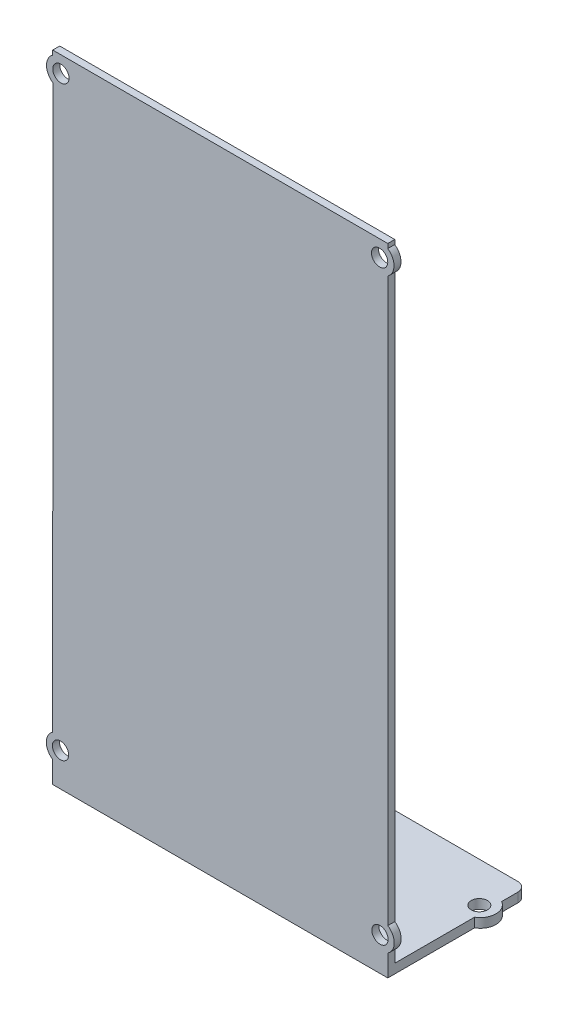
ISO-10303-21;
HEADER;
FILE_DESCRIPTION(('STEP AP214'),'2;1');
FILE_NAME('part.step','',(''),(''),'','','');
FILE_SCHEMA(('AUTOMOTIVE_DESIGN { 1 0 10303 214 1 1 1 1 }'));
ENDSEC;
DATA;
#1=APPLICATION_CONTEXT('core data for automotive mechanical design processes');
#2=APPLICATION_PROTOCOL_DEFINITION('international standard','automotive_design',2000,#1);
#3=PRODUCT_CONTEXT('',#1,'mechanical');
#4=PRODUCT('Part','Part','',(#3));
#5=PRODUCT_RELATED_PRODUCT_CATEGORY('part','',(#4));
#6=PRODUCT_DEFINITION_FORMATION('','',#4);
#7=PRODUCT_DEFINITION_CONTEXT('part definition',#1,'design');
#8=PRODUCT_DEFINITION('design','',#6,#7);
#9=PRODUCT_DEFINITION_SHAPE('','',#8);
#10=(LENGTH_UNIT() NAMED_UNIT(*) SI_UNIT(.MILLI.,.METRE.));
#11=(NAMED_UNIT(*) PLANE_ANGLE_UNIT() SI_UNIT($,.RADIAN.));
#12=(NAMED_UNIT(*) SI_UNIT($,.STERADIAN.) SOLID_ANGLE_UNIT());
#13=UNCERTAINTY_MEASURE_WITH_UNIT(LENGTH_MEASURE(1.E-05),#10,'distance_accuracy_value','');
#14=(GEOMETRIC_REPRESENTATION_CONTEXT(3) GLOBAL_UNCERTAINTY_ASSIGNED_CONTEXT((#13)) GLOBAL_UNIT_ASSIGNED_CONTEXT((#10,
#11,#12)) REPRESENTATION_CONTEXT('',''));
#15=CARTESIAN_POINT('',(0.,0.,0.));
#16=DIRECTION('',(0.,0.,1.));
#17=DIRECTION('',(1.,0.,0.));
#18=AXIS2_PLACEMENT_3D('',#15,#16,#17);
#19=CARTESIAN_POINT('',(36.,-134.5,1.5));
#20=DIRECTION('',(-1.,0.,0.));
#21=DIRECTION('',(0.,-1.,0.));
#22=AXIS2_PLACEMENT_3D('',#19,#20,#21);
#23=PLANE('',#22);
#24=DIRECTION('',(0.,0.,-1.));
#25=VECTOR('',#24,1.);
#26=CARTESIAN_POINT('',(36.,-136.7,1.5));
#27=LINE('',#26,#25);
#28=CARTESIAN_POINT('',(36.,-136.7,-22.9630116735406));
#29=VERTEX_POINT('',#28);
#30=CARTESIAN_POINT('',(36.,-136.7,-26.4468040913786));
#31=VERTEX_POINT('',#30);
#32=EDGE_CURVE('E321',#29,#31,#27,.T.);
#33=ORIENTED_EDGE('',*,*,#32,.T.);
#34=DIRECTION('',(0.,1.,0.));
#35=VECTOR('',#34,1.);
#36=CARTESIAN_POINT('',(36.,-134.7,-26.4468040913786));
#37=LINE('',#36,#35);
#38=CARTESIAN_POINT('',(36.,-134.7,-26.4468040913786));
#39=VERTEX_POINT('',#38);
#40=EDGE_CURVE('E41',#31,#39,#37,.T.);
#41=ORIENTED_EDGE('',*,*,#40,.T.);
#42=DIRECTION('',(0.,0.,1.));
#43=VECTOR('',#42,1.);
#44=CARTESIAN_POINT('',(36.,-134.7,-40.));
#45=LINE('',#44,#43);
#46=CARTESIAN_POINT('',(36.,-134.7,-22.9630116735406));
#47=VERTEX_POINT('',#46);
#48=EDGE_CURVE('E319',#39,#47,#45,.T.);
#49=ORIENTED_EDGE('',*,*,#48,.T.);
#50=DIRECTION('',(0.,-1.,0.));
#51=VECTOR('',#50,1.);
#52=CARTESIAN_POINT('',(36.,-134.7,-22.9630116735406));
#53=LINE('',#52,#51);
#54=EDGE_CURVE('E283',#47,#29,#53,.T.);
#55=ORIENTED_EDGE('',*,*,#54,.T.);
#56=EDGE_LOOP('',(#33,#41,#49,#55));
#57=FACE_BOUND('',#56,.T.);
#58=ADVANCED_FACE('F33',(#57),#23,.F.);
#59=CARTESIAN_POINT('',(77.7598086724783,-134.7,-40.));
#60=DIRECTION('',(0.,1.,0.));
#61=DIRECTION('',(0.,0.,1.));
#62=AXIS2_PLACEMENT_3D('',#59,#60,#61);
#63=PLANE('',#62);
#64=DIRECTION('',(1.,0.,0.));
#65=VECTOR('',#64,1.);
#66=CARTESIAN_POINT('',(77.7598086724783,-134.7,-5.5));
#67=LINE('',#66,#65);
#68=CARTESIAN_POINT('',(-31.,-134.7,-5.5));
#69=VERTEX_POINT('',#68);
#70=CARTESIAN_POINT('',(-1.5,-134.7,-5.5));
#71=VERTEX_POINT('',#70);
#72=EDGE_CURVE('E253',#69,#71,#67,.T.);
#73=ORIENTED_EDGE('',*,*,#72,.F.);
#74=DIRECTION('',(0.,0.,1.));
#75=VECTOR('',#74,1.);
#76=CARTESIAN_POINT('',(-31.,-134.7,-40.));
#77=LINE('',#76,#75);
#78=CARTESIAN_POINT('',(-31.,-134.7,-25.4468040913786));
#79=VERTEX_POINT('',#78);
#80=EDGE_CURVE('E259',#79,#69,#77,.T.);
#81=ORIENTED_EDGE('',*,*,#80,.F.);
#82=DIRECTION('',(-1.,0.,0.));
#83=VECTOR('',#82,1.);
#84=CARTESIAN_POINT('',(77.7598086724783,-134.7,-25.4468040913786));
#85=LINE('',#84,#83);
#86=CARTESIAN_POINT('',(4.00000000000001,-134.7,-25.4468040913786));
#87=VERTEX_POINT('',#86);
#88=EDGE_CURVE('E256',#87,#79,#85,.T.);
#89=ORIENTED_EDGE('',*,*,#88,.F.);
#90=DIRECTION('',(0.,0.,-1.));
#91=VECTOR('',#90,1.);
#92=CARTESIAN_POINT('',(4.,-134.7,-40.));
#93=LINE('',#92,#91);
#94=CARTESIAN_POINT('',(4.00000000000001,-134.7,-5.5));
#95=VERTEX_POINT('',#94);
#96=EDGE_CURVE('E226',#95,#87,#93,.T.);
#97=ORIENTED_EDGE('',*,*,#96,.F.);
#98=CARTESIAN_POINT('',(1.5,-134.7,-5.5));
#99=VERTEX_POINT('',#98);
#100=EDGE_CURVE('E250',#99,#95,#67,.T.);
#101=ORIENTED_EDGE('',*,*,#100,.F.);
#102=DIRECTION('',(0.,0.,-1.));
#103=VECTOR('',#102,1.);
#104=CARTESIAN_POINT('',(1.5,-134.7,-15.));
#105=LINE('',#104,#103);
#106=CARTESIAN_POINT('',(1.5,-134.7,0.));
#107=VERTEX_POINT('',#106);
#108=EDGE_CURVE('E303',#107,#99,#105,.T.);
#109=ORIENTED_EDGE('',*,*,#108,.F.);
#110=DIRECTION('',(-1.,0.,0.));
#111=VECTOR('',#110,1.);
#112=CARTESIAN_POINT('',(77.7598086724783,-134.7,0.));
#113=LINE('',#112,#111);
#114=CARTESIAN_POINT('',(36.,-134.7,0.));
#115=VERTEX_POINT('',#114);
#116=EDGE_CURVE('E335',#115,#107,#113,.T.);
#117=ORIENTED_EDGE('',*,*,#116,.F.);
#118=CARTESIAN_POINT('',(36.,-134.7,-17.152805246508));
#119=VERTEX_POINT('',#118);
#120=EDGE_CURVE('E322',#119,#115,#45,.T.);
#121=ORIENTED_EDGE('',*,*,#120,.F.);
#122=CARTESIAN_POINT('',(34.3298475995814,-134.7,-20.0579084600243));
#123=DIRECTION('',(0.,-1.,0.));
#124=DIRECTION('',(0.,0.,-1.));
#125=AXIS2_PLACEMENT_3D('',#122,#123,#124);
#126=CIRCLE('',#125,3.35097504046314);
#127=EDGE_CURVE('E277',#47,#119,#126,.T.);
#128=ORIENTED_EDGE('',*,*,#127,.F.);
#129=ORIENTED_EDGE('',*,*,#48,.F.);
#130=CARTESIAN_POINT('',(34.,-134.7,-26.4468040913786));
#131=DIRECTION('',(0.,1.,0.));
#132=DIRECTION('',(0.,0.,1.));
#133=AXIS2_PLACEMENT_3D('',#130,#131,#132);
#134=CIRCLE('',#133,2.);
#135=CARTESIAN_POINT('',(34.,-134.7,-28.4468040913786));
#136=VERTEX_POINT('',#135);
#137=EDGE_CURVE('E447',#39,#136,#134,.T.);
#138=ORIENTED_EDGE('',*,*,#137,.T.);
#139=DIRECTION('',(-1.,0.,0.));
#140=VECTOR('',#139,1.);
#141=CARTESIAN_POINT('',(77.7598086724783,-134.7,-28.4468040913786));
#142=LINE('',#141,#140);
#143=CARTESIAN_POINT('',(-34.,-134.7,-28.4468040913786));
#144=VERTEX_POINT('',#143);
#145=EDGE_CURVE('E261',#136,#144,#142,.T.);
#146=ORIENTED_EDGE('',*,*,#145,.T.);
#147=CARTESIAN_POINT('',(-34.,-134.7,-26.4468040913786));
#148=DIRECTION('',(0.,1.,0.));
#149=DIRECTION('',(0.,0.,1.));
#150=AXIS2_PLACEMENT_3D('',#147,#148,#149);
#151=CIRCLE('',#150,2.);
#152=CARTESIAN_POINT('',(-36.,-134.7,-26.4468040913786));
#153=VERTEX_POINT('',#152);
#154=EDGE_CURVE('E449',#144,#153,#151,.T.);
#155=ORIENTED_EDGE('',*,*,#154,.T.);
#156=DIRECTION('',(0.,0.,-1.));
#157=VECTOR('',#156,1.);
#158=CARTESIAN_POINT('',(-36.,-134.7,-40.));
#159=LINE('',#158,#157);
#160=CARTESIAN_POINT('',(-36.,-134.7,-22.9630116735406));
#161=VERTEX_POINT('',#160);
#162=EDGE_CURVE('E318',#161,#153,#159,.T.);
#163=ORIENTED_EDGE('',*,*,#162,.F.);
#164=CARTESIAN_POINT('',(-34.2683919243576,-134.7,-20.0579084600243));
#165=DIRECTION('',(0.,-1.,0.));
#166=DIRECTION('',(0.,0.,-1.));
#167=AXIS2_PLACEMENT_3D('',#164,#165,#166);
#168=CIRCLE('',#167,3.3820247203137);
#169=CARTESIAN_POINT('',(-36.,-134.7,-17.152805246508));
#170=VERTEX_POINT('',#169);
#171=EDGE_CURVE('E289',#170,#161,#168,.T.);
#172=ORIENTED_EDGE('',*,*,#171,.F.);
#173=CARTESIAN_POINT('',(-36.,-134.7,0.));
#174=VERTEX_POINT('',#173);
#175=EDGE_CURVE('E326',#174,#170,#159,.T.);
#176=ORIENTED_EDGE('',*,*,#175,.F.);
#177=CARTESIAN_POINT('',(-1.5,-134.7,0.));
#178=VERTEX_POINT('',#177);
#179=EDGE_CURVE('E331',#178,#174,#113,.T.);
#180=ORIENTED_EDGE('',*,*,#179,.F.);
#181=DIRECTION('',(0.,0.,-1.));
#182=VECTOR('',#181,1.);
#183=CARTESIAN_POINT('',(-1.5,-134.7,-15.));
#184=LINE('',#183,#182);
#185=EDGE_CURVE('E310',#178,#71,#184,.T.);
#186=ORIENTED_EDGE('',*,*,#185,.T.);
#187=EDGE_LOOP('',(#73,#81,#89,#97,#101,#109,#117,#121,#128,#129,#138,#146,#155,#163,#172,#176,
#180,#186));
#188=FACE_BOUND('',#187,.T.);
#189=CARTESIAN_POINT('',(34.2889777046585,-134.7,-19.8891594716713));
#190=DIRECTION('',(0.,-1.,0.));
#191=DIRECTION('',(0.,0.,-1.));
#192=AXIS2_PLACEMENT_3D('',#189,#190,#191);
#193=CIRCLE('',#192,1.75);
#194=CARTESIAN_POINT('',(34.2889777046585,-134.7,-21.6391594716713));
#195=VERTEX_POINT('',#194);
#196=EDGE_CURVE('E265',#195,#195,#193,.T.);
#197=ORIENTED_EDGE('',*,*,#196,.T.);
#198=EDGE_LOOP('',(#197));
#199=FACE_BOUND('',#198,.T.);
#200=CARTESIAN_POINT('',(-34.2539471146571,-134.7,-19.9468040913786));
#201=DIRECTION('',(0.,-1.,0.));
#202=DIRECTION('',(0.,0.,-1.));
#203=AXIS2_PLACEMENT_3D('',#200,#201,#202);
#204=CIRCLE('',#203,1.75);
#205=CARTESIAN_POINT('',(-34.2539471146571,-134.7,-21.6968040913786));
#206=VERTEX_POINT('',#205);
#207=EDGE_CURVE('E271',#206,#206,#204,.T.);
#208=ORIENTED_EDGE('',*,*,#207,.T.);
#209=EDGE_LOOP('',(#208));
#210=FACE_BOUND('',#209,.T.);
#211=ADVANCED_FACE('F467',(#188,#199,#210),#63,.T.);
#212=CARTESIAN_POINT('',(-36.,-132.049019419306,1.5));
#213=DIRECTION('',(1.,0.,0.));
#214=DIRECTION('',(0.,0.,-1.));
#215=AXIS2_PLACEMENT_3D('',#212,#213,#214);
#216=PLANE('',#215);
#217=ORIENTED_EDGE('',*,*,#162,.T.);
#218=DIRECTION('',(0.,1.,0.));
#219=VECTOR('',#218,1.);
#220=CARTESIAN_POINT('',(-36.,-136.7,-26.4468040913786));
#221=LINE('',#220,#219);
#222=CARTESIAN_POINT('',(-36.,-136.7,-26.4468040913786));
#223=VERTEX_POINT('',#222);
#224=EDGE_CURVE('E451',#153,#223,#221,.F.);
#225=ORIENTED_EDGE('',*,*,#224,.T.);
#226=DIRECTION('',(0.,0.,1.));
#227=VECTOR('',#226,1.);
#228=CARTESIAN_POINT('',(-36.,-136.7,1.5));
#229=LINE('',#228,#227);
#230=CARTESIAN_POINT('',(-36.,-136.7,-22.9630116735406));
#231=VERTEX_POINT('',#230);
#232=EDGE_CURVE('E329',#223,#231,#229,.T.);
#233=ORIENTED_EDGE('',*,*,#232,.T.);
#234=DIRECTION('',(0.,-1.,0.));
#235=VECTOR('',#234,1.);
#236=CARTESIAN_POINT('',(-36.,-134.7,-22.9630116735406));
#237=LINE('',#236,#235);
#238=EDGE_CURVE('E292',#161,#231,#237,.T.);
#239=ORIENTED_EDGE('',*,*,#238,.F.);
#240=EDGE_LOOP('',(#217,#225,#233,#239));
#241=FACE_BOUND('',#240,.T.);
#242=ADVANCED_FACE('F490',(#241),#216,.F.);
#243=CARTESIAN_POINT('',(77.7598086724783,-136.7,1.5));
#244=DIRECTION('',(0.,-1.,0.));
#245=DIRECTION('',(0.,0.,-1.));
#246=AXIS2_PLACEMENT_3D('',#243,#244,#245);
#247=PLANE('',#246);
#248=DIRECTION('',(0.,0.,-1.));
#249=VECTOR('',#248,1.);
#250=CARTESIAN_POINT('',(-31.,-136.7,-5.5));
#251=LINE('',#250,#249);
#252=CARTESIAN_POINT('',(-31.,-136.7,-5.5));
#253=VERTEX_POINT('',#252);
#254=CARTESIAN_POINT('',(-31.,-136.7,-25.4468040913786));
#255=VERTEX_POINT('',#254);
#256=EDGE_CURVE('E48',#253,#255,#251,.T.);
#257=ORIENTED_EDGE('',*,*,#256,.F.);
#258=DIRECTION('',(-1.,0.,0.));
#259=VECTOR('',#258,1.);
#260=CARTESIAN_POINT('',(-31.,-136.7,-5.5));
#261=LINE('',#260,#259);
#262=CARTESIAN_POINT('',(4.00000000000001,-136.7,-5.5));
#263=VERTEX_POINT('',#262);
#264=EDGE_CURVE('E240',#263,#253,#261,.T.);
#265=ORIENTED_EDGE('',*,*,#264,.F.);
#266=DIRECTION('',(0.,0.,1.));
#267=VECTOR('',#266,1.);
#268=CARTESIAN_POINT('',(4.00000000000001,-136.7,-5.5));
#269=LINE('',#268,#267);
#270=CARTESIAN_POINT('',(4.00000000000001,-136.7,-25.4468040913786));
#271=VERTEX_POINT('',#270);
#272=EDGE_CURVE('E223',#271,#263,#269,.T.);
#273=ORIENTED_EDGE('',*,*,#272,.F.);
#274=DIRECTION('',(1.,0.,0.));
#275=VECTOR('',#274,1.);
#276=CARTESIAN_POINT('',(-31.,-136.7,-25.4468040913786));
#277=LINE('',#276,#275);
#278=EDGE_CURVE('E233',#255,#271,#277,.T.);
#279=ORIENTED_EDGE('',*,*,#278,.F.);
#280=EDGE_LOOP('',(#257,#265,#273,#279));
#281=FACE_BOUND('',#280,.T.);
#282=CARTESIAN_POINT('',(34.2889777046585,-136.7,-19.8891594716713));
#283=DIRECTION('',(0.,-1.,0.));
#284=DIRECTION('',(0.,0.,-1.));
#285=AXIS2_PLACEMENT_3D('',#282,#283,#284);
#286=CIRCLE('',#285,1.75);
#287=CARTESIAN_POINT('',(34.2889777046585,-136.7,-21.6391594716713));
#288=VERTEX_POINT('',#287);
#289=EDGE_CURVE('E264',#288,#288,#286,.T.);
#290=ORIENTED_EDGE('',*,*,#289,.F.);
#291=EDGE_LOOP('',(#290));
#292=FACE_BOUND('',#291,.T.);
#293=CARTESIAN_POINT('',(-34.2539471146571,-136.7,-19.9468040913786));
#294=DIRECTION('',(0.,-1.,0.));
#295=DIRECTION('',(0.,0.,-1.));
#296=AXIS2_PLACEMENT_3D('',#293,#294,#295);
#297=CIRCLE('',#296,1.75);
#298=CARTESIAN_POINT('',(-34.2539471146571,-136.7,-21.6968040913786));
#299=VERTEX_POINT('',#298);
#300=EDGE_CURVE('E268',#299,#299,#297,.T.);
#301=ORIENTED_EDGE('',*,*,#300,.F.);
#302=EDGE_LOOP('',(#301));
#303=FACE_BOUND('',#302,.T.);
#304=ORIENTED_EDGE('',*,*,#232,.F.);
#305=CARTESIAN_POINT('',(-34.,-136.7,-26.4468040913786));
#306=DIRECTION('',(0.,-1.,0.));
#307=DIRECTION('',(0.,0.,-1.));
#308=AXIS2_PLACEMENT_3D('',#305,#306,#307);
#309=CIRCLE('',#308,2.);
#310=CARTESIAN_POINT('',(-34.,-136.7,-28.4468040913786));
#311=VERTEX_POINT('',#310);
#312=EDGE_CURVE('E455',#223,#311,#309,.T.);
#313=ORIENTED_EDGE('',*,*,#312,.T.);
#314=DIRECTION('',(1.,0.,0.));
#315=VECTOR('',#314,1.);
#316=CARTESIAN_POINT('',(77.7598086724783,-136.7,-28.4468040913786));
#317=LINE('',#316,#315);
#318=CARTESIAN_POINT('',(34.,-136.7,-28.4468040913786));
#319=VERTEX_POINT('',#318);
#320=EDGE_CURVE('E439',#311,#319,#317,.T.);
#321=ORIENTED_EDGE('',*,*,#320,.T.);
#322=CARTESIAN_POINT('',(34.,-136.7,-26.4468040913786));
#323=DIRECTION('',(0.,-1.,0.));
#324=DIRECTION('',(0.,0.,-1.));
#325=AXIS2_PLACEMENT_3D('',#322,#323,#324);
#326=CIRCLE('',#325,2.);
#327=EDGE_CURVE('E453',#319,#31,#326,.T.);
#328=ORIENTED_EDGE('',*,*,#327,.T.);
#329=ORIENTED_EDGE('',*,*,#32,.F.);
#330=CARTESIAN_POINT('',(34.3298475995814,-136.7,-20.0579084600243));
#331=DIRECTION('',(0.,-1.,0.));
#332=DIRECTION('',(0.,0.,-1.));
#333=AXIS2_PLACEMENT_3D('',#330,#331,#332);
#334=CIRCLE('',#333,3.35097504046314);
#335=CARTESIAN_POINT('',(36.,-136.7,-17.152805246508));
#336=VERTEX_POINT('',#335);
#337=EDGE_CURVE('E274',#29,#336,#334,.T.);
#338=ORIENTED_EDGE('',*,*,#337,.T.);
#339=CARTESIAN_POINT('',(36.,-136.7,1.5));
#340=VERTEX_POINT('',#339);
#341=EDGE_CURVE('E323',#340,#336,#27,.T.);
#342=ORIENTED_EDGE('',*,*,#341,.F.);
#343=DIRECTION('',(-1.,0.,0.));
#344=VECTOR('',#343,1.);
#345=CARTESIAN_POINT('',(77.7598086724783,-136.7,1.5));
#346=LINE('',#345,#344);
#347=CARTESIAN_POINT('',(-36.,-136.7,1.5));
#348=VERTEX_POINT('',#347);
#349=EDGE_CURVE('E332',#340,#348,#346,.T.);
#350=ORIENTED_EDGE('',*,*,#349,.T.);
#351=CARTESIAN_POINT('',(-36.,-136.7,-17.152805246508));
#352=VERTEX_POINT('',#351);
#353=EDGE_CURVE('E328',#352,#348,#229,.T.);
#354=ORIENTED_EDGE('',*,*,#353,.F.);
#355=CARTESIAN_POINT('',(-34.2683919243576,-136.7,-20.0579084600243));
#356=DIRECTION('',(0.,-1.,0.));
#357=DIRECTION('',(0.,0.,-1.));
#358=AXIS2_PLACEMENT_3D('',#355,#356,#357);
#359=CIRCLE('',#358,3.3820247203137);
#360=EDGE_CURVE('E286',#352,#231,#359,.T.);
#361=ORIENTED_EDGE('',*,*,#360,.T.);
#362=EDGE_LOOP('',(#304,#313,#321,#328,#329,#338,#342,#350,#354,#361));
#363=FACE_BOUND('',#362,.T.);
#364=ADVANCED_FACE('F237',(#281,#292,#303,#363),#247,.T.);
#365=ORIENTED_EDGE('',*,*,#175,.T.);
#366=DIRECTION('',(0.,-1.,0.));
#367=VECTOR('',#366,1.);
#368=CARTESIAN_POINT('',(-36.,-134.7,-17.152805246508));
#369=LINE('',#368,#367);
#370=EDGE_CURVE('E295',#170,#352,#369,.T.);
#371=ORIENTED_EDGE('',*,*,#370,.T.);
#372=ORIENTED_EDGE('',*,*,#353,.T.);
#373=DIRECTION('',(0.,-1.,0.));
#374=VECTOR('',#373,1.);
#375=CARTESIAN_POINT('',(-36.,-132.049019419306,1.5));
#376=LINE('',#375,#374);
#377=CARTESIAN_POINT('',(-36.,-132.049019419306,1.5));
#378=VERTEX_POINT('',#377);
#379=EDGE_CURVE('E370',#378,#348,#376,.T.);
#380=ORIENTED_EDGE('',*,*,#379,.F.);
#381=DIRECTION('',(0.,0.,-1.));
#382=VECTOR('',#381,1.);
#383=CARTESIAN_POINT('',(-36.,-132.049019419306,1.5));
#384=LINE('',#383,#382);
#385=CARTESIAN_POINT('',(-36.,-132.049019419306,0.));
#386=VERTEX_POINT('',#385);
#387=EDGE_CURVE('E430',#378,#386,#384,.T.);
#388=ORIENTED_EDGE('',*,*,#387,.T.);
#389=DIRECTION('',(0.,-1.,0.));
#390=VECTOR('',#389,1.);
#391=CARTESIAN_POINT('',(-36.,-132.049019419306,0.));
#392=LINE('',#391,#390);
#393=EDGE_CURVE('E394',#386,#174,#392,.T.);
#394=ORIENTED_EDGE('',*,*,#393,.T.);
#395=EDGE_LOOP('',(#365,#371,#372,#380,#388,#394));
#396=FACE_BOUND('',#395,.T.);
#397=ADVANCED_FACE('F501',(#396),#216,.F.);
#398=CARTESIAN_POINT('',(-34.2441201109013,-3.50057895588954,0.));
#399=DIRECTION('',(0.,0.,1.));
#400=DIRECTION('',(1.,0.,0.));
#401=AXIS2_PLACEMENT_3D('',#398,#399,#400);
#402=PLANE('',#401);
#403=CARTESIAN_POINT('',(-34.2441201109013,-3.50057895588954,0.));
#404=DIRECTION('',(0.,0.,1.));
#405=DIRECTION('',(1.,0.,0.));
#406=AXIS2_PLACEMENT_3D('',#403,#404,#405);
#407=CIRCLE('',#406,1.75);
#408=CARTESIAN_POINT('',(-32.4941201109013,-3.50057895588954,0.));
#409=VERTEX_POINT('',#408);
#410=EDGE_CURVE('E325',#409,#409,#407,.T.);
#411=ORIENTED_EDGE('',*,*,#410,.T.);
#412=EDGE_LOOP('',(#411));
#413=FACE_BOUND('',#412,.T.);
#414=CARTESIAN_POINT('',(34.3232110429555,-129.5,0.));
#415=DIRECTION('',(0.,0.,1.));
#416=DIRECTION('',(1.,0.,0.));
#417=AXIS2_PLACEMENT_3D('',#414,#415,#416);
#418=CIRCLE('',#417,1.75);
#419=CARTESIAN_POINT('',(36.0732110429555,-129.5,0.));
#420=VERTEX_POINT('',#419);
#421=EDGE_CURVE('E347',#420,#420,#418,.T.);
#422=ORIENTED_EDGE('',*,*,#421,.T.);
#423=EDGE_LOOP('',(#422));
#424=FACE_BOUND('',#423,.T.);
#425=CARTESIAN_POINT('',(-34.3286095869045,-129.5,0.));
#426=DIRECTION('',(0.,0.,1.));
#427=DIRECTION('',(1.,0.,0.));
#428=AXIS2_PLACEMENT_3D('',#425,#426,#427);
#429=CIRCLE('',#428,1.75);
#430=CARTESIAN_POINT('',(-32.5786095869045,-129.5,0.));
#431=VERTEX_POINT('',#430);
#432=EDGE_CURVE('E353',#431,#431,#429,.T.);
#433=ORIENTED_EDGE('',*,*,#432,.T.);
#434=EDGE_LOOP('',(#433));
#435=FACE_BOUND('',#434,.T.);
#436=CARTESIAN_POINT('',(34.2426522067053,-3.5,0.));
#437=DIRECTION('',(0.,0.,1.));
#438=DIRECTION('',(1.,0.,0.));
#439=AXIS2_PLACEMENT_3D('',#436,#437,#438);
#440=CIRCLE('',#439,1.75);
#441=CARTESIAN_POINT('',(35.9926522067053,-3.5,0.));
#442=VERTEX_POINT('',#441);
#443=EDGE_CURVE('E341',#442,#442,#440,.T.);
#444=ORIENTED_EDGE('',*,*,#443,.T.);
#445=EDGE_LOOP('',(#444));
#446=FACE_BOUND('',#445,.T.);
#447=DIRECTION('',(0.,-1.,0.));
#448=VECTOR('',#447,1.);
#449=CARTESIAN_POINT('',(-1.5,-134.7,0.));
#450=LINE('',#449,#448);
#451=CARTESIAN_POINT('',(-1.5,-119.7,0.));
#452=VERTEX_POINT('',#451);
#453=EDGE_CURVE('E308',#452,#178,#450,.T.);
#454=ORIENTED_EDGE('',*,*,#453,.T.);
#455=ORIENTED_EDGE('',*,*,#179,.T.);
#456=ORIENTED_EDGE('',*,*,#393,.F.);
#457=CARTESIAN_POINT('',(-34.3286095869045,-129.5,0.));
#458=DIRECTION('',(0.,0.,1.));
#459=DIRECTION('',(1.,0.,0.));
#460=AXIS2_PLACEMENT_3D('',#457,#458,#459);
#461=CIRCLE('',#460,3.0481217024567);
#462=CARTESIAN_POINT('',(-36.,-126.950980580694,0.));
#463=VERTEX_POINT('',#462);
#464=EDGE_CURVE('E392',#463,#386,#461,.T.);
#465=ORIENTED_EDGE('',*,*,#464,.F.);
#466=DIRECTION('',(-4.94595307986486E-05,-0.999999998776877,0.));
#467=VECTOR('',#466,1.);
#468=CARTESIAN_POINT('',(-35.9940205061552,-6.05428502089234,0.));
#469=LINE('',#468,#467);
#470=CARTESIAN_POINT('',(-35.9940205061552,-6.05428502089234,0.));
#471=VERTEX_POINT('',#470);
#472=EDGE_CURVE('E390',#471,#463,#469,.T.);
#473=ORIENTED_EDGE('',*,*,#472,.F.);
#474=CARTESIAN_POINT('',(-34.2441201109013,-3.50057895588954,0.));
#475=DIRECTION('',(0.,0.,1.));
#476=DIRECTION('',(1.,0.,0.));
#477=AXIS2_PLACEMENT_3D('',#474,#475,#476);
#478=CIRCLE('',#477,3.09573352531219);
#479=CARTESIAN_POINT('',(-36.,-0.950980580693833,0.));
#480=VERTEX_POINT('',#479);
#481=EDGE_CURVE('E359',#480,#471,#478,.T.);
#482=ORIENTED_EDGE('',*,*,#481,.F.);
#483=DIRECTION('',(0.,-1.,0.));
#484=VECTOR('',#483,1.);
#485=CARTESIAN_POINT('',(-36.,0.,0.));
#486=LINE('',#485,#484);
#487=CARTESIAN_POINT('',(-36.,0.,0.));
#488=VERTEX_POINT('',#487);
#489=EDGE_CURVE('E366',#488,#480,#486,.T.);
#490=ORIENTED_EDGE('',*,*,#489,.F.);
#491=DIRECTION('',(-1.,0.,0.));
#492=VECTOR('',#491,1.);
#493=CARTESIAN_POINT('',(36.,0.,0.));
#494=LINE('',#493,#492);
#495=CARTESIAN_POINT('',(36.,0.,0.));
#496=VERTEX_POINT('',#495);
#497=EDGE_CURVE('E407',#496,#488,#494,.T.);
#498=ORIENTED_EDGE('',*,*,#497,.F.);
#499=DIRECTION('',(0.,1.,0.));
#500=VECTOR('',#499,1.);
#501=CARTESIAN_POINT('',(36.,-0.950980580693824,0.));
#502=LINE('',#501,#500);
#503=CARTESIAN_POINT('',(36.,-0.950980580693824,0.));
#504=VERTEX_POINT('',#503);
#505=EDGE_CURVE('E405',#504,#496,#502,.T.);
#506=ORIENTED_EDGE('',*,*,#505,.F.);
#507=CARTESIAN_POINT('',(34.2426522067053,-3.5,0.));
#508=DIRECTION('',(0.,0.,1.));
#509=DIRECTION('',(1.,0.,0.));
#510=AXIS2_PLACEMENT_3D('',#507,#508,#509);
#511=CIRCLE('',#510,3.0960896735395);
#512=CARTESIAN_POINT('',(36.,-6.04901941930617,0.));
#513=VERTEX_POINT('',#512);
#514=EDGE_CURVE('E403',#513,#504,#511,.T.);
#515=ORIENTED_EDGE('',*,*,#514,.F.);
#516=DIRECTION('',(0.,1.,0.));
#517=VECTOR('',#516,1.);
#518=CARTESIAN_POINT('',(36.,-126.950980580694,0.));
#519=LINE('',#518,#517);
#520=CARTESIAN_POINT('',(36.,-126.950980580694,0.));
#521=VERTEX_POINT('',#520);
#522=EDGE_CURVE('E401',#521,#513,#519,.T.);
#523=ORIENTED_EDGE('',*,*,#522,.F.);
#524=CARTESIAN_POINT('',(34.3232110429555,-129.5,0.));
#525=DIRECTION('',(0.,0.,1.));
#526=DIRECTION('',(1.,0.,0.));
#527=AXIS2_PLACEMENT_3D('',#524,#525,#526);
#528=CIRCLE('',#527,3.05108525060614);
#529=CARTESIAN_POINT('',(36.,-132.049019419306,0.));
#530=VERTEX_POINT('',#529);
#531=EDGE_CURVE('E399',#530,#521,#528,.T.);
#532=ORIENTED_EDGE('',*,*,#531,.F.);
#533=DIRECTION('',(0.,1.,0.));
#534=VECTOR('',#533,1.);
#535=CARTESIAN_POINT('',(36.,-134.5,0.));
#536=LINE('',#535,#534);
#537=EDGE_CURVE('E397',#115,#530,#536,.T.);
#538=ORIENTED_EDGE('',*,*,#537,.F.);
#539=ORIENTED_EDGE('',*,*,#116,.T.);
#540=DIRECTION('',(0.,-1.,0.));
#541=VECTOR('',#540,1.);
#542=CARTESIAN_POINT('',(1.5,-134.7,0.));
#543=LINE('',#542,#541);
#544=CARTESIAN_POINT('',(1.5,-119.7,0.));
#545=VERTEX_POINT('',#544);
#546=EDGE_CURVE('E298',#545,#107,#543,.T.);
#547=ORIENTED_EDGE('',*,*,#546,.F.);
#548=DIRECTION('',(1.,0.,0.));
#549=VECTOR('',#548,1.);
#550=CARTESIAN_POINT('',(-1.5,-119.7,0.));
#551=LINE('',#550,#549);
#552=EDGE_CURVE('E315',#452,#545,#551,.T.);
#553=ORIENTED_EDGE('',*,*,#552,.F.);
#554=EDGE_LOOP('',(#454,#455,#456,#465,#473,#482,#490,#498,#506,#515,#523,#532,#538,#539,#547,#553));
#555=FACE_BOUND('',#554,.T.);
#556=ADVANCED_FACE('F507',(#413,#424,#435,#446,#555),#402,.F.);
#557=CARTESIAN_POINT('',(-34.2441201109013,-3.50057895588954,1.5));
#558=DIRECTION('',(0.,0.,1.));
#559=DIRECTION('',(1.,0.,0.));
#560=AXIS2_PLACEMENT_3D('',#557,#558,#559);
#561=PLANE('',#560);
#562=CARTESIAN_POINT('',(-34.3286095869045,-129.5,1.5));
#563=DIRECTION('',(0.,0.,1.));
#564=DIRECTION('',(1.,0.,0.));
#565=AXIS2_PLACEMENT_3D('',#562,#563,#564);
#566=CIRCLE('',#565,3.0481217024567);
#567=CARTESIAN_POINT('',(-36.,-126.950980580694,1.5));
#568=VERTEX_POINT('',#567);
#569=EDGE_CURVE('E368',#568,#378,#566,.T.);
#570=ORIENTED_EDGE('',*,*,#569,.T.);
#571=ORIENTED_EDGE('',*,*,#379,.T.);
#572=ORIENTED_EDGE('',*,*,#349,.F.);
#573=DIRECTION('',(0.,1.,0.));
#574=VECTOR('',#573,1.);
#575=CARTESIAN_POINT('',(36.,-134.5,1.5));
#576=LINE('',#575,#574);
#577=CARTESIAN_POINT('',(36.,-132.049019419306,1.5));
#578=VERTEX_POINT('',#577);
#579=EDGE_CURVE('E373',#340,#578,#576,.T.);
#580=ORIENTED_EDGE('',*,*,#579,.T.);
#581=CARTESIAN_POINT('',(34.3232110429555,-129.5,1.5));
#582=DIRECTION('',(0.,0.,1.));
#583=DIRECTION('',(1.,0.,0.));
#584=AXIS2_PLACEMENT_3D('',#581,#582,#583);
#585=CIRCLE('',#584,3.05108525060614);
#586=CARTESIAN_POINT('',(36.,-126.950980580694,1.5));
#587=VERTEX_POINT('',#586);
#588=EDGE_CURVE('E375',#578,#587,#585,.T.);
#589=ORIENTED_EDGE('',*,*,#588,.T.);
#590=DIRECTION('',(0.,1.,0.));
#591=VECTOR('',#590,1.);
#592=CARTESIAN_POINT('',(36.,-126.950980580694,1.5));
#593=LINE('',#592,#591);
#594=CARTESIAN_POINT('',(36.,-6.04901941930617,1.5));
#595=VERTEX_POINT('',#594);
#596=EDGE_CURVE('E377',#587,#595,#593,.T.);
#597=ORIENTED_EDGE('',*,*,#596,.T.);
#598=CARTESIAN_POINT('',(34.2426522067053,-3.5,1.5));
#599=DIRECTION('',(0.,0.,1.));
#600=DIRECTION('',(1.,0.,0.));
#601=AXIS2_PLACEMENT_3D('',#598,#599,#600);
#602=CIRCLE('',#601,3.0960896735395);
#603=CARTESIAN_POINT('',(36.,-0.950980580693824,1.5));
#604=VERTEX_POINT('',#603);
#605=EDGE_CURVE('E379',#595,#604,#602,.T.);
#606=ORIENTED_EDGE('',*,*,#605,.T.);
#607=DIRECTION('',(0.,1.,0.));
#608=VECTOR('',#607,1.);
#609=CARTESIAN_POINT('',(36.,-0.950980580693824,1.5));
#610=LINE('',#609,#608);
#611=CARTESIAN_POINT('',(36.,0.,1.5));
#612=VERTEX_POINT('',#611);
#613=EDGE_CURVE('E381',#604,#612,#610,.T.);
#614=ORIENTED_EDGE('',*,*,#613,.T.);
#615=DIRECTION('',(-1.,0.,0.));
#616=VECTOR('',#615,1.);
#617=CARTESIAN_POINT('',(36.,0.,1.5));
#618=LINE('',#617,#616);
#619=CARTESIAN_POINT('',(-36.,0.,1.5));
#620=VERTEX_POINT('',#619);
#621=EDGE_CURVE('E383',#612,#620,#618,.T.);
#622=ORIENTED_EDGE('',*,*,#621,.T.);
#623=DIRECTION('',(0.,-1.,0.));
#624=VECTOR('',#623,1.);
#625=CARTESIAN_POINT('',(-36.,0.,1.5));
#626=LINE('',#625,#624);
#627=CARTESIAN_POINT('',(-36.,-0.950980580693833,1.5));
#628=VERTEX_POINT('',#627);
#629=EDGE_CURVE('E385',#620,#628,#626,.T.);
#630=ORIENTED_EDGE('',*,*,#629,.T.);
#631=CARTESIAN_POINT('',(-34.2441201109013,-3.50057895588954,1.5));
#632=DIRECTION('',(0.,0.,1.));
#633=DIRECTION('',(1.,0.,0.));
#634=AXIS2_PLACEMENT_3D('',#631,#632,#633);
#635=CIRCLE('',#634,3.09573352531219);
#636=CARTESIAN_POINT('',(-35.9940205061552,-6.05428502089234,1.5));
#637=VERTEX_POINT('',#636);
#638=EDGE_CURVE('E362',#628,#637,#635,.T.);
#639=ORIENTED_EDGE('',*,*,#638,.T.);
#640=DIRECTION('',(-4.94595307986486E-05,-0.999999998776877,0.));
#641=VECTOR('',#640,1.);
#642=CARTESIAN_POINT('',(-35.9940205061552,-6.05428502089234,1.5));
#643=LINE('',#642,#641);
#644=EDGE_CURVE('E365',#637,#568,#643,.T.);
#645=ORIENTED_EDGE('',*,*,#644,.T.);
#646=EDGE_LOOP('',(#570,#571,#572,#580,#589,#597,#606,#614,#622,#630,#639,#645));
#647=FACE_BOUND('',#646,.T.);
#648=CARTESIAN_POINT('',(34.2426522067053,-3.5,1.5));
#649=DIRECTION('',(0.,0.,1.));
#650=DIRECTION('',(1.,0.,0.));
#651=AXIS2_PLACEMENT_3D('',#648,#649,#650);
#652=CIRCLE('',#651,1.75);
#653=CARTESIAN_POINT('',(35.9926522067053,-3.5,1.5));
#654=VERTEX_POINT('',#653);
#655=EDGE_CURVE('E344',#654,#654,#652,.T.);
#656=ORIENTED_EDGE('',*,*,#655,.F.);
#657=EDGE_LOOP('',(#656));
#658=FACE_BOUND('',#657,.T.);
#659=CARTESIAN_POINT('',(-34.3286095869045,-129.5,1.5));
#660=DIRECTION('',(0.,0.,1.));
#661=DIRECTION('',(1.,0.,0.));
#662=AXIS2_PLACEMENT_3D('',#659,#660,#661);
#663=CIRCLE('',#662,1.75);
#664=CARTESIAN_POINT('',(-32.5786095869045,-129.5,1.5));
#665=VERTEX_POINT('',#664);
#666=EDGE_CURVE('E356',#665,#665,#663,.T.);
#667=ORIENTED_EDGE('',*,*,#666,.F.);
#668=EDGE_LOOP('',(#667));
#669=FACE_BOUND('',#668,.T.);
#670=CARTESIAN_POINT('',(34.3232110429555,-129.5,1.5));
#671=DIRECTION('',(0.,0.,1.));
#672=DIRECTION('',(1.,0.,0.));
#673=AXIS2_PLACEMENT_3D('',#670,#671,#672);
#674=CIRCLE('',#673,1.75);
#675=CARTESIAN_POINT('',(36.0732110429555,-129.5,1.5));
#676=VERTEX_POINT('',#675);
#677=EDGE_CURVE('E350',#676,#676,#674,.T.);
#678=ORIENTED_EDGE('',*,*,#677,.F.);
#679=EDGE_LOOP('',(#678));
#680=FACE_BOUND('',#679,.T.);
#681=CARTESIAN_POINT('',(-34.2441201109013,-3.50057895588954,1.5));
#682=DIRECTION('',(0.,0.,1.));
#683=DIRECTION('',(1.,0.,0.));
#684=AXIS2_PLACEMENT_3D('',#681,#682,#683);
#685=CIRCLE('',#684,1.75);
#686=CARTESIAN_POINT('',(-32.4941201109013,-3.50057895588954,1.5));
#687=VERTEX_POINT('',#686);
#688=EDGE_CURVE('E338',#687,#687,#685,.T.);
#689=ORIENTED_EDGE('',*,*,#688,.F.);
#690=EDGE_LOOP('',(#689));
#691=FACE_BOUND('',#690,.T.);
#692=ADVANCED_FACE('F552',(#647,#658,#669,#680,#691),#561,.T.);
#693=CARTESIAN_POINT('',(-34.2441201109013,-3.50057895588954,1.5));
#694=DIRECTION('',(0.,0.,-1.));
#695=DIRECTION('',(-1.,0.,0.));
#696=AXIS2_PLACEMENT_3D('',#693,#694,#695);
#697=CYLINDRICAL_SURFACE('',#696,3.09573352531219);
#698=ORIENTED_EDGE('',*,*,#481,.T.);
#699=DIRECTION('',(0.,0.,-1.));
#700=VECTOR('',#699,1.);
#701=CARTESIAN_POINT('',(-35.9940205061552,-6.05428502089234,1.5));
#702=LINE('',#701,#700);
#703=EDGE_CURVE('E436',#637,#471,#702,.T.);
#704=ORIENTED_EDGE('',*,*,#703,.F.);
#705=ORIENTED_EDGE('',*,*,#638,.F.);
#706=DIRECTION('',(0.,0.,-1.));
#707=VECTOR('',#706,1.);
#708=CARTESIAN_POINT('',(-36.,-0.950980580693833,1.5));
#709=LINE('',#708,#707);
#710=EDGE_CURVE('E387',#628,#480,#709,.T.);
#711=ORIENTED_EDGE('',*,*,#710,.T.);
#712=EDGE_LOOP('',(#698,#704,#705,#711));
#713=FACE_BOUND('',#712,.T.);
#714=ADVANCED_FACE('F563',(#713),#697,.T.);
#715=CARTESIAN_POINT('',(-35.9940205061552,-6.05428502089234,1.5));
#716=DIRECTION('',(0.999999998776877,-4.94595307986486E-05,0.));
#717=DIRECTION('',(4.94595307986486E-05,0.999999998776877,0.));
#718=AXIS2_PLACEMENT_3D('',#715,#716,#717);
#719=PLANE('',#718);
#720=ORIENTED_EDGE('',*,*,#472,.T.);
#721=DIRECTION('',(0.,0.,-1.));
#722=VECTOR('',#721,1.);
#723=CARTESIAN_POINT('',(-36.,-126.950980580694,1.5));
#724=LINE('',#723,#722);
#725=EDGE_CURVE('E433',#568,#463,#724,.T.);
#726=ORIENTED_EDGE('',*,*,#725,.F.);
#727=ORIENTED_EDGE('',*,*,#644,.F.);
#728=ORIENTED_EDGE('',*,*,#703,.T.);
#729=EDGE_LOOP('',(#720,#726,#727,#728));
#730=FACE_BOUND('',#729,.T.);
#731=ADVANCED_FACE('F546',(#730),#719,.F.);
#732=CARTESIAN_POINT('',(-34.3286095869045,-129.5,1.5));
#733=DIRECTION('',(0.,0.,-1.));
#734=DIRECTION('',(-1.,0.,0.));
#735=AXIS2_PLACEMENT_3D('',#732,#733,#734);
#736=CYLINDRICAL_SURFACE('',#735,3.0481217024567);
#737=ORIENTED_EDGE('',*,*,#464,.T.);
#738=ORIENTED_EDGE('',*,*,#387,.F.);
#739=ORIENTED_EDGE('',*,*,#569,.F.);
#740=ORIENTED_EDGE('',*,*,#725,.T.);
#741=EDGE_LOOP('',(#737,#738,#739,#740));
#742=FACE_BOUND('',#741,.T.);
#743=ADVANCED_FACE('F538',(#742),#736,.T.);
#744=ORIENTED_EDGE('',*,*,#341,.T.);
#745=DIRECTION('',(0.,-1.,0.));
#746=VECTOR('',#745,1.);
#747=CARTESIAN_POINT('',(36.,-134.7,-17.152805246508));
#748=LINE('',#747,#746);
#749=EDGE_CURVE('E280',#119,#336,#748,.T.);
#750=ORIENTED_EDGE('',*,*,#749,.F.);
#751=ORIENTED_EDGE('',*,*,#120,.T.);
#752=ORIENTED_EDGE('',*,*,#537,.T.);
#753=DIRECTION('',(0.,0.,-1.));
#754=VECTOR('',#753,1.);
#755=CARTESIAN_POINT('',(36.,-132.049019419306,1.5));
#756=LINE('',#755,#754);
#757=EDGE_CURVE('E427',#578,#530,#756,.T.);
#758=ORIENTED_EDGE('',*,*,#757,.F.);
#759=ORIENTED_EDGE('',*,*,#579,.F.);
#760=EDGE_LOOP('',(#744,#750,#751,#752,#758,#759));
#761=FACE_BOUND('',#760,.T.);
#762=ADVANCED_FACE('F529',(#761),#23,.F.);
#763=CARTESIAN_POINT('',(34.3232110429555,-129.5,1.5));
#764=DIRECTION('',(0.,0.,-1.));
#765=DIRECTION('',(-1.,0.,0.));
#766=AXIS2_PLACEMENT_3D('',#763,#764,#765);
#767=CYLINDRICAL_SURFACE('',#766,3.05108525060614);
#768=ORIENTED_EDGE('',*,*,#531,.T.);
#769=DIRECTION('',(0.,0.,-1.));
#770=VECTOR('',#769,1.);
#771=CARTESIAN_POINT('',(36.,-126.950980580694,1.5));
#772=LINE('',#771,#770);
#773=EDGE_CURVE('E424',#587,#521,#772,.T.);
#774=ORIENTED_EDGE('',*,*,#773,.F.);
#775=ORIENTED_EDGE('',*,*,#588,.F.);
#776=ORIENTED_EDGE('',*,*,#757,.T.);
#777=EDGE_LOOP('',(#768,#774,#775,#776));
#778=FACE_BOUND('',#777,.T.);
#779=ADVANCED_FACE('F537',(#778),#767,.T.);
#780=CARTESIAN_POINT('',(36.,-126.950980580694,1.5));
#781=DIRECTION('',(-1.,0.,0.));
#782=DIRECTION('',(0.,-1.,0.));
#783=AXIS2_PLACEMENT_3D('',#780,#781,#782);
#784=PLANE('',#783);
#785=ORIENTED_EDGE('',*,*,#522,.T.);
#786=DIRECTION('',(0.,0.,-1.));
#787=VECTOR('',#786,1.);
#788=CARTESIAN_POINT('',(36.,-6.04901941930617,1.5));
#789=LINE('',#788,#787);
#790=EDGE_CURVE('E421',#595,#513,#789,.T.);
#791=ORIENTED_EDGE('',*,*,#790,.F.);
#792=ORIENTED_EDGE('',*,*,#596,.F.);
#793=ORIENTED_EDGE('',*,*,#773,.T.);
#794=EDGE_LOOP('',(#785,#791,#792,#793));
#795=FACE_BOUND('',#794,.T.);
#796=ADVANCED_FACE('F544',(#795),#784,.F.);
#797=CARTESIAN_POINT('',(34.2426522067053,-3.5,1.5));
#798=DIRECTION('',(0.,0.,-1.));
#799=DIRECTION('',(-1.,0.,0.));
#800=AXIS2_PLACEMENT_3D('',#797,#798,#799);
#801=CYLINDRICAL_SURFACE('',#800,3.0960896735395);
#802=ORIENTED_EDGE('',*,*,#514,.T.);
#803=DIRECTION('',(0.,0.,-1.));
#804=VECTOR('',#803,1.);
#805=CARTESIAN_POINT('',(36.,-0.950980580693824,1.5));
#806=LINE('',#805,#804);
#807=EDGE_CURVE('E418',#604,#504,#806,.T.);
#808=ORIENTED_EDGE('',*,*,#807,.F.);
#809=ORIENTED_EDGE('',*,*,#605,.F.);
#810=ORIENTED_EDGE('',*,*,#790,.T.);
#811=EDGE_LOOP('',(#802,#808,#809,#810));
#812=FACE_BOUND('',#811,.T.);
#813=ADVANCED_FACE('F583',(#812),#801,.T.);
#814=CARTESIAN_POINT('',(36.,-0.950980580693824,1.5));
#815=DIRECTION('',(-1.,0.,0.));
#816=DIRECTION('',(0.,0.,1.));
#817=AXIS2_PLACEMENT_3D('',#814,#815,#816);
#818=PLANE('',#817);
#819=ORIENTED_EDGE('',*,*,#505,.T.);
#820=DIRECTION('',(0.,0.,-1.));
#821=VECTOR('',#820,1.);
#822=CARTESIAN_POINT('',(36.,0.,1.5));
#823=LINE('',#822,#821);
#824=EDGE_CURVE('E415',#612,#496,#823,.T.);
#825=ORIENTED_EDGE('',*,*,#824,.F.);
#826=ORIENTED_EDGE('',*,*,#613,.F.);
#827=ORIENTED_EDGE('',*,*,#807,.T.);
#828=EDGE_LOOP('',(#819,#825,#826,#827));
#829=FACE_BOUND('',#828,.T.);
#830=ADVANCED_FACE('F578',(#829),#818,.F.);
#831=CARTESIAN_POINT('',(36.,0.,1.5));
#832=DIRECTION('',(0.,-1.,0.));
#833=DIRECTION('',(0.,0.,-1.));
#834=AXIS2_PLACEMENT_3D('',#831,#832,#833);
#835=PLANE('',#834);
#836=ORIENTED_EDGE('',*,*,#497,.T.);
#837=DIRECTION('',(0.,0.,-1.));
#838=VECTOR('',#837,1.);
#839=CARTESIAN_POINT('',(-36.,0.,1.5));
#840=LINE('',#839,#838);
#841=EDGE_CURVE('E412',#620,#488,#840,.T.);
#842=ORIENTED_EDGE('',*,*,#841,.F.);
#843=ORIENTED_EDGE('',*,*,#621,.F.);
#844=ORIENTED_EDGE('',*,*,#824,.T.);
#845=EDGE_LOOP('',(#836,#842,#843,#844));
#846=FACE_BOUND('',#845,.T.);
#847=ADVANCED_FACE('F572',(#846),#835,.F.);
#848=CARTESIAN_POINT('',(-36.,0.,1.5));
#849=DIRECTION('',(1.,0.,0.));
#850=DIRECTION('',(0.,0.,-1.));
#851=AXIS2_PLACEMENT_3D('',#848,#849,#850);
#852=PLANE('',#851);
#853=ORIENTED_EDGE('',*,*,#489,.T.);
#854=ORIENTED_EDGE('',*,*,#710,.F.);
#855=ORIENTED_EDGE('',*,*,#629,.F.);
#856=ORIENTED_EDGE('',*,*,#841,.T.);
#857=EDGE_LOOP('',(#853,#854,#855,#856));
#858=FACE_BOUND('',#857,.T.);
#859=ADVANCED_FACE('F568',(#858),#852,.F.);
#860=CARTESIAN_POINT('',(-34.3286095869045,-129.5,1.5));
#861=DIRECTION('',(0.,0.,-1.));
#862=DIRECTION('',(-1.,0.,0.));
#863=AXIS2_PLACEMENT_3D('',#860,#861,#862);
#864=CYLINDRICAL_SURFACE('',#863,1.75);
#865=ORIENTED_EDGE('',*,*,#666,.T.);
#866=EDGE_LOOP('',(#865));
#867=FACE_BOUND('',#866,.T.);
#868=ORIENTED_EDGE('',*,*,#432,.F.);
#869=EDGE_LOOP('',(#868));
#870=FACE_BOUND('',#869,.T.);
#871=ADVANCED_FACE('F616',(#867,#870),#864,.F.);
#872=CARTESIAN_POINT('',(34.3232110429555,-129.5,1.5));
#873=DIRECTION('',(0.,0.,-1.));
#874=DIRECTION('',(-1.,0.,0.));
#875=AXIS2_PLACEMENT_3D('',#872,#873,#874);
#876=CYLINDRICAL_SURFACE('',#875,1.75);
#877=ORIENTED_EDGE('',*,*,#677,.T.);
#878=EDGE_LOOP('',(#877));
#879=FACE_BOUND('',#878,.T.);
#880=ORIENTED_EDGE('',*,*,#421,.F.);
#881=EDGE_LOOP('',(#880));
#882=FACE_BOUND('',#881,.T.);
#883=ADVANCED_FACE('F612',(#879,#882),#876,.F.);
#884=CARTESIAN_POINT('',(34.2426522067053,-3.5,1.5));
#885=DIRECTION('',(0.,0.,-1.));
#886=DIRECTION('',(-1.,0.,0.));
#887=AXIS2_PLACEMENT_3D('',#884,#885,#886);
#888=CYLINDRICAL_SURFACE('',#887,1.75);
#889=ORIENTED_EDGE('',*,*,#655,.T.);
#890=EDGE_LOOP('',(#889));
#891=FACE_BOUND('',#890,.T.);
#892=ORIENTED_EDGE('',*,*,#443,.F.);
#893=EDGE_LOOP('',(#892));
#894=FACE_BOUND('',#893,.T.);
#895=ADVANCED_FACE('F603',(#891,#894),#888,.F.);
#896=CARTESIAN_POINT('',(-34.2441201109013,-3.50057895588954,1.5));
#897=DIRECTION('',(0.,0.,-1.));
#898=DIRECTION('',(-1.,0.,0.));
#899=AXIS2_PLACEMENT_3D('',#896,#897,#898);
#900=CYLINDRICAL_SURFACE('',#899,1.75);
#901=ORIENTED_EDGE('',*,*,#688,.T.);
#902=EDGE_LOOP('',(#901));
#903=FACE_BOUND('',#902,.T.);
#904=ORIENTED_EDGE('',*,*,#410,.F.);
#905=EDGE_LOOP('',(#904));
#906=FACE_BOUND('',#905,.T.);
#907=ADVANCED_FACE('F596',(#903,#906),#900,.F.);
#908=CARTESIAN_POINT('',(-1.5,-119.7,0.));
#909=DIRECTION('',(0.,0.707106781186547,-0.707106781186547));
#910=DIRECTION('',(0.,0.707106781186548,0.707106781186548));
#911=AXIS2_PLACEMENT_3D('',#908,#909,#910);
#912=PLANE('',#911);
#913=DIRECTION('',(1.,0.,0.));
#914=VECTOR('',#913,1.);
#915=CARTESIAN_POINT('',(-1.5,-125.2,-5.5));
#916=LINE('',#915,#914);
#917=CARTESIAN_POINT('',(-1.5,-125.2,-5.5));
#918=VERTEX_POINT('',#917);
#919=CARTESIAN_POINT('',(1.5,-125.2,-5.5));
#920=VERTEX_POINT('',#919);
#921=EDGE_CURVE('E55',#918,#920,#916,.T.);
#922=ORIENTED_EDGE('',*,*,#921,.F.);
#923=DIRECTION('',(0.,0.707106781186548,0.707106781186548));
#924=VECTOR('',#923,1.);
#925=CARTESIAN_POINT('',(-1.5,-119.7,0.));
#926=LINE('',#925,#924);
#927=EDGE_CURVE('E313',#918,#452,#926,.T.);
#928=ORIENTED_EDGE('',*,*,#927,.T.);
#929=ORIENTED_EDGE('',*,*,#552,.T.);
#930=DIRECTION('',(0.,0.707106781186548,0.707106781186548));
#931=VECTOR('',#930,1.);
#932=CARTESIAN_POINT('',(1.5,-119.7,0.));
#933=LINE('',#932,#931);
#934=EDGE_CURVE('E306',#920,#545,#933,.T.);
#935=ORIENTED_EDGE('',*,*,#934,.F.);
#936=EDGE_LOOP('',(#922,#928,#929,#935));
#937=FACE_BOUND('',#936,.T.);
#938=ADVANCED_FACE('F594',(#937),#912,.T.);
#939=CARTESIAN_POINT('',(-1.5,0.,0.));
#940=DIRECTION('',(1.,0.,0.));
#941=DIRECTION('',(0.,0.,-1.));
#942=AXIS2_PLACEMENT_3D('',#939,#940,#941);
#943=PLANE('',#942);
#944=ORIENTED_EDGE('',*,*,#927,.F.);
#945=DIRECTION('',(0.,-1.,0.));
#946=VECTOR('',#945,1.);
#947=CARTESIAN_POINT('',(-1.5,0.,-5.5));
#948=LINE('',#947,#946);
#949=EDGE_CURVE('E252',#918,#71,#948,.T.);
#950=ORIENTED_EDGE('',*,*,#949,.T.);
#951=ORIENTED_EDGE('',*,*,#185,.F.);
#952=ORIENTED_EDGE('',*,*,#453,.F.);
#953=EDGE_LOOP('',(#944,#950,#951,#952));
#954=FACE_BOUND('',#953,.T.);
#955=ADVANCED_FACE('F513',(#954),#943,.F.);
#956=CARTESIAN_POINT('',(1.5,0.,0.));
#957=DIRECTION('',(1.,0.,0.));
#958=DIRECTION('',(0.,0.,-1.));
#959=AXIS2_PLACEMENT_3D('',#956,#957,#958);
#960=PLANE('',#959);
#961=DIRECTION('',(0.,-1.,0.));
#962=VECTOR('',#961,1.);
#963=CARTESIAN_POINT('',(1.5,0.,-5.5));
#964=LINE('',#963,#962);
#965=EDGE_CURVE('E11',#920,#99,#964,.T.);
#966=ORIENTED_EDGE('',*,*,#965,.F.);
#967=ORIENTED_EDGE('',*,*,#934,.T.);
#968=ORIENTED_EDGE('',*,*,#546,.T.);
#969=ORIENTED_EDGE('',*,*,#108,.T.);
#970=EDGE_LOOP('',(#966,#967,#968,#969));
#971=FACE_BOUND('',#970,.T.);
#972=ADVANCED_FACE('F591',(#971),#960,.T.);
#973=CARTESIAN_POINT('',(-34.2683919243576,-134.7,-20.0579084600243));
#974=DIRECTION('',(0.,-1.,0.));
#975=DIRECTION('',(0.,0.,-1.));
#976=AXIS2_PLACEMENT_3D('',#973,#974,#975);
#977=CYLINDRICAL_SURFACE('',#976,3.3820247203137);
#978=ORIENTED_EDGE('',*,*,#360,.F.);
#979=ORIENTED_EDGE('',*,*,#370,.F.);
#980=ORIENTED_EDGE('',*,*,#171,.T.);
#981=ORIENTED_EDGE('',*,*,#238,.T.);
#982=EDGE_LOOP('',(#978,#979,#980,#981));
#983=FACE_BOUND('',#982,.T.);
#984=ADVANCED_FACE('F495',(#983),#977,.T.);
#985=CARTESIAN_POINT('',(34.3298475995814,-134.7,-20.0579084600243));
#986=DIRECTION('',(0.,-1.,0.));
#987=DIRECTION('',(0.,0.,-1.));
#988=AXIS2_PLACEMENT_3D('',#985,#986,#987);
#989=CYLINDRICAL_SURFACE('',#988,3.35097504046314);
#990=ORIENTED_EDGE('',*,*,#337,.F.);
#991=ORIENTED_EDGE('',*,*,#54,.F.);
#992=ORIENTED_EDGE('',*,*,#127,.T.);
#993=ORIENTED_EDGE('',*,*,#749,.T.);
#994=EDGE_LOOP('',(#990,#991,#992,#993));
#995=FACE_BOUND('',#994,.T.);
#996=ADVANCED_FACE('F474',(#995),#989,.T.);
#997=CARTESIAN_POINT('',(-34.2539471146571,-134.7,-19.9468040913786));
#998=DIRECTION('',(0.,-1.,0.));
#999=DIRECTION('',(0.,0.,-1.));
#1000=AXIS2_PLACEMENT_3D('',#997,#998,#999);
#1001=CYLINDRICAL_SURFACE('',#1000,1.75);
#1002=ORIENTED_EDGE('',*,*,#207,.F.);
#1003=EDGE_LOOP('',(#1002));
#1004=FACE_BOUND('',#1003,.T.);
#1005=ORIENTED_EDGE('',*,*,#300,.T.);
#1006=EDGE_LOOP('',(#1005));
#1007=FACE_BOUND('',#1006,.T.);
#1008=ADVANCED_FACE('F719',(#1004,#1007),#1001,.F.);
#1009=CARTESIAN_POINT('',(34.2889777046585,-134.7,-19.8891594716713));
#1010=DIRECTION('',(0.,-1.,0.));
#1011=DIRECTION('',(0.,0.,-1.));
#1012=AXIS2_PLACEMENT_3D('',#1009,#1010,#1011);
#1013=CYLINDRICAL_SURFACE('',#1012,1.75);
#1014=ORIENTED_EDGE('',*,*,#196,.F.);
#1015=EDGE_LOOP('',(#1014));
#1016=FACE_BOUND('',#1015,.T.);
#1017=ORIENTED_EDGE('',*,*,#289,.T.);
#1018=EDGE_LOOP('',(#1017));
#1019=FACE_BOUND('',#1018,.T.);
#1020=ADVANCED_FACE('F728',(#1016,#1019),#1013,.F.);
#1021=CARTESIAN_POINT('',(-36.7840466051845,-341.081523161525,-28.4468040913786));
#1022=DIRECTION('',(0.,0.,-1.));
#1023=DIRECTION('',(-1.,0.,0.));
#1024=AXIS2_PLACEMENT_3D('',#1021,#1022,#1023);
#1025=PLANE('',#1024);
#1026=ORIENTED_EDGE('',*,*,#320,.F.);
#1027=DIRECTION('',(0.,1.,0.));
#1028=VECTOR('',#1027,1.);
#1029=CARTESIAN_POINT('',(-34.,-134.7,-28.4468040913786));
#1030=LINE('',#1029,#1028);
#1031=EDGE_CURVE('E444',#311,#144,#1030,.T.);
#1032=ORIENTED_EDGE('',*,*,#1031,.T.);
#1033=ORIENTED_EDGE('',*,*,#145,.F.);
#1034=DIRECTION('',(0.,1.,0.));
#1035=VECTOR('',#1034,1.);
#1036=CARTESIAN_POINT('',(34.,-136.7,-28.4468040913786));
#1037=LINE('',#1036,#1035);
#1038=EDGE_CURVE('E442',#136,#319,#1037,.F.);
#1039=ORIENTED_EDGE('',*,*,#1038,.T.);
#1040=EDGE_LOOP('',(#1026,#1032,#1033,#1039));
#1041=FACE_BOUND('',#1040,.T.);
#1042=ADVANCED_FACE('F482',(#1041),#1025,.T.);
#1043=CARTESIAN_POINT('',(-34.,-341.081523161525,-26.4468040913786));
#1044=DIRECTION('',(0.,-1.,0.));
#1045=DIRECTION('',(0.,0.,-1.));
#1046=AXIS2_PLACEMENT_3D('',#1043,#1044,#1045);
#1047=CYLINDRICAL_SURFACE('',#1046,2.);
#1048=ORIENTED_EDGE('',*,*,#312,.F.);
#1049=ORIENTED_EDGE('',*,*,#224,.F.);
#1050=ORIENTED_EDGE('',*,*,#154,.F.);
#1051=ORIENTED_EDGE('',*,*,#1031,.F.);
#1052=EDGE_LOOP('',(#1048,#1049,#1050,#1051));
#1053=FACE_BOUND('',#1052,.T.);
#1054=ADVANCED_FACE('F492',(#1053),#1047,.T.);
#1055=CARTESIAN_POINT('',(34.,-134.5,-26.4468040913786));
#1056=DIRECTION('',(0.,-1.,0.));
#1057=DIRECTION('',(1.,0.,0.));
#1058=AXIS2_PLACEMENT_3D('',#1055,#1056,#1057);
#1059=CYLINDRICAL_SURFACE('',#1058,2.);
#1060=ORIENTED_EDGE('',*,*,#327,.F.);
#1061=ORIENTED_EDGE('',*,*,#1038,.F.);
#1062=ORIENTED_EDGE('',*,*,#137,.F.);
#1063=ORIENTED_EDGE('',*,*,#40,.F.);
#1064=EDGE_LOOP('',(#1060,#1061,#1062,#1063));
#1065=FACE_BOUND('',#1064,.T.);
#1066=ADVANCED_FACE('F35',(#1065),#1059,.T.);
#1067=CARTESIAN_POINT('',(-31.,-114.273777899539,-5.5));
#1068=DIRECTION('',(-1.,0.,0.));
#1069=DIRECTION('',(0.,0.,1.));
#1070=AXIS2_PLACEMENT_3D('',#1067,#1068,#1069);
#1071=PLANE('',#1070);
#1072=ORIENTED_EDGE('',*,*,#80,.T.);
#1073=DIRECTION('',(0.,-1.,0.));
#1074=VECTOR('',#1073,1.);
#1075=CARTESIAN_POINT('',(-31.,-114.273777899539,-5.5));
#1076=LINE('',#1075,#1074);
#1077=EDGE_CURVE('E245',#69,#253,#1076,.T.);
#1078=ORIENTED_EDGE('',*,*,#1077,.T.);
#1079=ORIENTED_EDGE('',*,*,#256,.T.);
#1080=DIRECTION('',(0.,-1.,0.));
#1081=VECTOR('',#1080,1.);
#1082=CARTESIAN_POINT('',(-31.,-114.273777899539,-25.4468040913786));
#1083=LINE('',#1082,#1081);
#1084=EDGE_CURVE('E230',#79,#255,#1083,.T.);
#1085=ORIENTED_EDGE('',*,*,#1084,.F.);
#1086=EDGE_LOOP('',(#1072,#1078,#1079,#1085));
#1087=FACE_BOUND('',#1086,.T.);
#1088=ADVANCED_FACE('F517',(#1087),#1071,.F.);
#1089=CARTESIAN_POINT('',(-31.,-114.273777899539,-5.5));
#1090=DIRECTION('',(0.,0.,1.));
#1091=DIRECTION('',(1.,0.,0.));
#1092=AXIS2_PLACEMENT_3D('',#1089,#1090,#1091);
#1093=PLANE('',#1092);
#1094=ORIENTED_EDGE('',*,*,#72,.T.);
#1095=ORIENTED_EDGE('',*,*,#949,.F.);
#1096=ORIENTED_EDGE('',*,*,#921,.T.);
#1097=ORIENTED_EDGE('',*,*,#965,.T.);
#1098=ORIENTED_EDGE('',*,*,#100,.T.);
#1099=DIRECTION('',(0.,-1.,0.));
#1100=VECTOR('',#1099,1.);
#1101=CARTESIAN_POINT('',(4.00000000000001,-114.273777899539,-5.5));
#1102=LINE('',#1101,#1100);
#1103=EDGE_CURVE('E229',#95,#263,#1102,.T.);
#1104=ORIENTED_EDGE('',*,*,#1103,.T.);
#1105=ORIENTED_EDGE('',*,*,#264,.T.);
#1106=ORIENTED_EDGE('',*,*,#1077,.F.);
#1107=EDGE_LOOP('',(#1094,#1095,#1096,#1097,#1098,#1104,#1105,#1106));
#1108=FACE_BOUND('',#1107,.T.);
#1109=ADVANCED_FACE('F516',(#1108),#1093,.F.);
#1110=CARTESIAN_POINT('',(4.00000000000001,-114.273777899539,-5.5));
#1111=DIRECTION('',(1.,0.,0.));
#1112=DIRECTION('',(0.,0.,-1.));
#1113=AXIS2_PLACEMENT_3D('',#1110,#1111,#1112);
#1114=PLANE('',#1113);
#1115=ORIENTED_EDGE('',*,*,#96,.T.);
#1116=DIRECTION('',(0.,-1.,0.));
#1117=VECTOR('',#1116,1.);
#1118=CARTESIAN_POINT('',(4.00000000000001,-114.273777899539,-25.4468040913786));
#1119=LINE('',#1118,#1117);
#1120=EDGE_CURVE('E218',#87,#271,#1119,.T.);
#1121=ORIENTED_EDGE('',*,*,#1120,.T.);
#1122=ORIENTED_EDGE('',*,*,#272,.T.);
#1123=ORIENTED_EDGE('',*,*,#1103,.F.);
#1124=EDGE_LOOP('',(#1115,#1121,#1122,#1123));
#1125=FACE_BOUND('',#1124,.T.);
#1126=ADVANCED_FACE('F220',(#1125),#1114,.F.);
#1127=CARTESIAN_POINT('',(-31.,-114.273777899539,-25.4468040913786));
#1128=DIRECTION('',(0.,0.,-1.));
#1129=DIRECTION('',(-1.,0.,0.));
#1130=AXIS2_PLACEMENT_3D('',#1127,#1128,#1129);
#1131=PLANE('',#1130);
#1132=ORIENTED_EDGE('',*,*,#88,.T.);
#1133=ORIENTED_EDGE('',*,*,#1084,.T.);
#1134=ORIENTED_EDGE('',*,*,#278,.T.);
#1135=ORIENTED_EDGE('',*,*,#1120,.F.);
#1136=EDGE_LOOP('',(#1132,#1133,#1134,#1135));
#1137=FACE_BOUND('',#1136,.T.);
#1138=ADVANCED_FACE('F234',(#1137),#1131,.F.);
#1139=CLOSED_SHELL('',(#58,#211,#242,#364,#397,#556,#692,#714,#731,#743,#762,#779,#796,#813,
#830,#847,#859,#871,#883,#895,#907,#938,#955,#972,#984,#996,#1008,#1020,#1042,#1054,#1066,#1088,
#1109,#1126,#1138));
#1140=MANIFOLD_SOLID_BREP('B2',#1139);
#1141=ADVANCED_BREP_SHAPE_REPRESENTATION('',(#18,#1140),#14);
#1142=SHAPE_DEFINITION_REPRESENTATION(#9,#1141);
ENDSEC;
END-ISO-10303-21;
